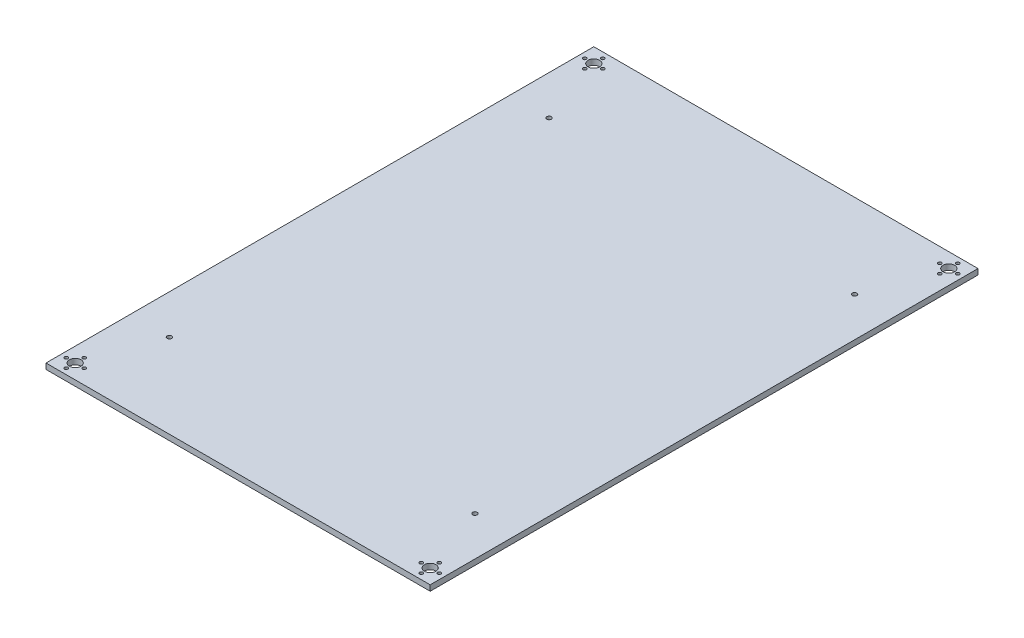
ISO-10303-21;
HEADER;
FILE_DESCRIPTION(('STEP AP214'),'2;1');
FILE_NAME('part.step','',(''),(''),'','','');
FILE_SCHEMA(('AUTOMOTIVE_DESIGN { 1 0 10303 214 1 1 1 1 }'));
ENDSEC;
DATA;
#1=APPLICATION_CONTEXT('core data for automotive mechanical design processes');
#2=APPLICATION_PROTOCOL_DEFINITION('international standard','automotive_design',2000,#1);
#3=PRODUCT_CONTEXT('',#1,'mechanical');
#4=PRODUCT('Part','Part','',(#3));
#5=PRODUCT_RELATED_PRODUCT_CATEGORY('part','',(#4));
#6=PRODUCT_DEFINITION_FORMATION('','',#4);
#7=PRODUCT_DEFINITION_CONTEXT('part definition',#1,'design');
#8=PRODUCT_DEFINITION('design','',#6,#7);
#9=PRODUCT_DEFINITION_SHAPE('','',#8);
#10=(LENGTH_UNIT() NAMED_UNIT(*) SI_UNIT(.MILLI.,.METRE.));
#11=(NAMED_UNIT(*) PLANE_ANGLE_UNIT() SI_UNIT($,.RADIAN.));
#12=(NAMED_UNIT(*) SI_UNIT($,.STERADIAN.) SOLID_ANGLE_UNIT());
#13=UNCERTAINTY_MEASURE_WITH_UNIT(LENGTH_MEASURE(1.E-05),#10,'distance_accuracy_value','');
#14=(GEOMETRIC_REPRESENTATION_CONTEXT(3) GLOBAL_UNCERTAINTY_ASSIGNED_CONTEXT((#13)) GLOBAL_UNIT_ASSIGNED_CONTEXT((#10,
#11,#12)) REPRESENTATION_CONTEXT('',''));
#15=CARTESIAN_POINT('',(0.,0.,0.));
#16=DIRECTION('',(0.,0.,1.));
#17=DIRECTION('',(1.,0.,0.));
#18=AXIS2_PLACEMENT_3D('',#15,#16,#17);
#19=CARTESIAN_POINT('',(342.,5.,0.));
#20=DIRECTION('',(0.,0.,1.));
#21=DIRECTION('',(1.,0.,0.));
#22=AXIS2_PLACEMENT_3D('',#19,#20,#21);
#23=PLANE('',#22);
#24=DIRECTION('',(0.,1.,0.));
#25=VECTOR('',#24,1.);
#26=CARTESIAN_POINT('',(0.,5.,0.));
#27=LINE('',#26,#25);
#28=CARTESIAN_POINT('',(0.,0.,0.));
#29=VERTEX_POINT('',#28);
#30=CARTESIAN_POINT('',(0.,5.,0.));
#31=VERTEX_POINT('',#30);
#32=EDGE_CURVE('E114',#29,#31,#27,.T.);
#33=ORIENTED_EDGE('',*,*,#32,.T.);
#34=DIRECTION('',(-1.,0.,0.));
#35=VECTOR('',#34,1.);
#36=CARTESIAN_POINT('',(342.,5.,0.));
#37=LINE('',#36,#35);
#38=CARTESIAN_POINT('',(342.,5.,0.));
#39=VERTEX_POINT('',#38);
#40=EDGE_CURVE('E11',#39,#31,#37,.T.);
#41=ORIENTED_EDGE('',*,*,#40,.F.);
#42=DIRECTION('',(0.,1.,0.));
#43=VECTOR('',#42,1.);
#44=CARTESIAN_POINT('',(342.,5.,0.));
#45=LINE('',#44,#43);
#46=CARTESIAN_POINT('',(342.,0.,0.));
#47=VERTEX_POINT('',#46);
#48=EDGE_CURVE('E102',#47,#39,#45,.T.);
#49=ORIENTED_EDGE('',*,*,#48,.F.);
#50=DIRECTION('',(-1.,0.,0.));
#51=VECTOR('',#50,1.);
#52=CARTESIAN_POINT('',(342.,0.,0.));
#53=LINE('',#52,#51);
#54=EDGE_CURVE('E110',#47,#29,#53,.T.);
#55=ORIENTED_EDGE('',*,*,#54,.T.);
#56=EDGE_LOOP('',(#33,#41,#49,#55));
#57=FACE_BOUND('',#56,.T.);
#58=ADVANCED_FACE('F51',(#57),#23,.F.);
#59=CARTESIAN_POINT('',(342.,4.99999999999985,487.65));
#60=DIRECTION('',(0.,-1.,0.));
#61=DIRECTION('',(0.,0.,-1.));
#62=AXIS2_PLACEMENT_3D('',#59,#60,#61);
#63=PLANE('',#62);
#64=CARTESIAN_POINT('',(35.,4.99999999999987,412.825));
#65=DIRECTION('',(0.,1.,0.));
#66=DIRECTION('',(0.,0.,1.));
#67=AXIS2_PLACEMENT_3D('',#64,#65,#66);
#68=CIRCLE('',#67,2.);
#69=CARTESIAN_POINT('',(35.,4.99999999999987,414.825));
#70=VERTEX_POINT('',#69);
#71=EDGE_CURVE('E257',#70,#70,#68,.T.);
#72=ORIENTED_EDGE('',*,*,#71,.F.);
#73=EDGE_LOOP('',(#72));
#74=FACE_BOUND('',#73,.T.);
#75=CARTESIAN_POINT('',(307.,4.99999999999987,412.825));
#76=DIRECTION('',(0.,1.,0.));
#77=DIRECTION('',(0.,0.,1.));
#78=AXIS2_PLACEMENT_3D('',#75,#76,#77);
#79=CIRCLE('',#78,2.);
#80=CARTESIAN_POINT('',(307.,4.99999999999987,414.825));
#81=VERTEX_POINT('',#80);
#82=EDGE_CURVE('E263',#81,#81,#79,.T.);
#83=ORIENTED_EDGE('',*,*,#82,.F.);
#84=EDGE_LOOP('',(#83));
#85=FACE_BOUND('',#84,.T.);
#86=CARTESIAN_POINT('',(307.,4.99999999999998,74.825));
#87=DIRECTION('',(0.,1.,0.));
#88=DIRECTION('',(0.,0.,1.));
#89=AXIS2_PLACEMENT_3D('',#86,#87,#88);
#90=CIRCLE('',#89,2.);
#91=CARTESIAN_POINT('',(307.,4.99999999999998,76.825));
#92=VERTEX_POINT('',#91);
#93=EDGE_CURVE('E251',#92,#92,#90,.T.);
#94=ORIENTED_EDGE('',*,*,#93,.F.);
#95=EDGE_LOOP('',(#94));
#96=FACE_BOUND('',#95,.T.);
#97=CARTESIAN_POINT('',(35.,4.99999999999998,74.825));
#98=DIRECTION('',(0.,1.,0.));
#99=DIRECTION('',(0.,0.,1.));
#100=AXIS2_PLACEMENT_3D('',#97,#98,#99);
#101=CIRCLE('',#100,2.);
#102=CARTESIAN_POINT('',(35.,4.99999999999998,76.825));
#103=VERTEX_POINT('',#102);
#104=EDGE_CURVE('E248',#103,#103,#101,.T.);
#105=ORIENTED_EDGE('',*,*,#104,.F.);
#106=EDGE_LOOP('',(#105));
#107=FACE_BOUND('',#106,.T.);
#108=CARTESIAN_POINT('',(5.00000000000001,5.00000000000003,474.65));
#109=DIRECTION('',(0.,1.,0.));
#110=DIRECTION('',(0.,0.,1.));
#111=AXIS2_PLACEMENT_3D('',#108,#109,#110);
#112=CIRCLE('',#111,1.5);
#113=CARTESIAN_POINT('',(5.00000000000001,5.00000000000003,476.15));
#114=VERTEX_POINT('',#113);
#115=EDGE_CURVE('E197',#114,#114,#112,.T.);
#116=ORIENTED_EDGE('',*,*,#115,.F.);
#117=EDGE_LOOP('',(#116));
#118=FACE_BOUND('',#117,.T.);
#119=CARTESIAN_POINT('',(21.,5.00000000000003,474.65));
#120=DIRECTION('',(0.,1.,0.));
#121=DIRECTION('',(0.,0.,1.));
#122=AXIS2_PLACEMENT_3D('',#119,#120,#121);
#123=CIRCLE('',#122,1.5);
#124=CARTESIAN_POINT('',(21.,5.00000000000003,476.15));
#125=VERTEX_POINT('',#124);
#126=EDGE_CURVE('E186',#125,#125,#123,.T.);
#127=ORIENTED_EDGE('',*,*,#126,.F.);
#128=EDGE_LOOP('',(#127));
#129=FACE_BOUND('',#128,.T.);
#130=CARTESIAN_POINT('',(13.,5.00000000000003,482.65));
#131=DIRECTION('',(0.,1.,0.));
#132=DIRECTION('',(0.,0.,1.));
#133=AXIS2_PLACEMENT_3D('',#130,#131,#132);
#134=CIRCLE('',#133,1.5);
#135=CARTESIAN_POINT('',(13.,5.00000000000003,484.15));
#136=VERTEX_POINT('',#135);
#137=EDGE_CURVE('E185',#136,#136,#134,.T.);
#138=ORIENTED_EDGE('',*,*,#137,.F.);
#139=EDGE_LOOP('',(#138));
#140=FACE_BOUND('',#139,.T.);
#141=CARTESIAN_POINT('',(13.,5.,13.));
#142=DIRECTION('',(0.,1.,0.));
#143=DIRECTION('',(0.,0.,1.));
#144=AXIS2_PLACEMENT_3D('',#141,#142,#143);
#145=CIRCLE('',#144,5.09999999999999);
#146=CARTESIAN_POINT('',(13.,5.,18.1));
#147=VERTEX_POINT('',#146);
#148=EDGE_CURVE('E152',#147,#147,#145,.T.);
#149=ORIENTED_EDGE('',*,*,#148,.F.);
#150=EDGE_LOOP('',(#149));
#151=FACE_BOUND('',#150,.T.);
#152=CARTESIAN_POINT('',(13.,5.00000000000003,466.65));
#153=DIRECTION('',(0.,1.,0.));
#154=DIRECTION('',(0.,0.,1.));
#155=AXIS2_PLACEMENT_3D('',#152,#153,#154);
#156=CIRCLE('',#155,1.5);
#157=CARTESIAN_POINT('',(13.,5.00000000000003,468.15));
#158=VERTEX_POINT('',#157);
#159=EDGE_CURVE('E198',#158,#158,#156,.T.);
#160=ORIENTED_EDGE('',*,*,#159,.F.);
#161=EDGE_LOOP('',(#160));
#162=FACE_BOUND('',#161,.T.);
#163=CARTESIAN_POINT('',(321.,5.00000000000003,474.65));
#164=DIRECTION('',(0.,1.,0.));
#165=DIRECTION('',(0.,0.,1.));
#166=AXIS2_PLACEMENT_3D('',#163,#164,#165);
#167=CIRCLE('',#166,1.50000000000002);
#168=CARTESIAN_POINT('',(321.,5.00000000000003,476.15));
#169=VERTEX_POINT('',#168);
#170=EDGE_CURVE('E222',#169,#169,#167,.T.);
#171=ORIENTED_EDGE('',*,*,#170,.F.);
#172=EDGE_LOOP('',(#171));
#173=FACE_BOUND('',#172,.T.);
#174=CARTESIAN_POINT('',(329.,5.00000000000003,482.65));
#175=DIRECTION('',(0.,1.,0.));
#176=DIRECTION('',(0.,0.,1.));
#177=AXIS2_PLACEMENT_3D('',#174,#175,#176);
#178=CIRCLE('',#177,1.50000000000002);
#179=CARTESIAN_POINT('',(329.,5.00000000000003,484.15));
#180=VERTEX_POINT('',#179);
#181=EDGE_CURVE('E216',#180,#180,#178,.T.);
#182=ORIENTED_EDGE('',*,*,#181,.F.);
#183=EDGE_LOOP('',(#182));
#184=FACE_BOUND('',#183,.T.);
#185=CARTESIAN_POINT('',(329.,5.00000000000003,466.65));
#186=DIRECTION('',(0.,1.,0.));
#187=DIRECTION('',(0.,0.,1.));
#188=AXIS2_PLACEMENT_3D('',#185,#186,#187);
#189=CIRCLE('',#188,1.50000000000002);
#190=CARTESIAN_POINT('',(329.,5.00000000000003,468.15));
#191=VERTEX_POINT('',#190);
#192=EDGE_CURVE('E209',#191,#191,#189,.T.);
#193=ORIENTED_EDGE('',*,*,#192,.F.);
#194=EDGE_LOOP('',(#193));
#195=FACE_BOUND('',#194,.T.);
#196=CARTESIAN_POINT('',(21.,5.,13.));
#197=DIRECTION('',(0.,1.,0.));
#198=DIRECTION('',(0.,0.,1.));
#199=AXIS2_PLACEMENT_3D('',#196,#197,#198);
#200=CIRCLE('',#199,1.5);
#201=CARTESIAN_POINT('',(21.,5.,14.5));
#202=VERTEX_POINT('',#201);
#203=EDGE_CURVE('E144',#202,#202,#200,.T.);
#204=ORIENTED_EDGE('',*,*,#203,.F.);
#205=EDGE_LOOP('',(#204));
#206=FACE_BOUND('',#205,.T.);
#207=CARTESIAN_POINT('',(13.,5.,21.));
#208=DIRECTION('',(0.,1.,0.));
#209=DIRECTION('',(0.,0.,1.));
#210=AXIS2_PLACEMENT_3D('',#207,#208,#209);
#211=CIRCLE('',#210,1.5);
#212=CARTESIAN_POINT('',(13.,5.,22.5));
#213=VERTEX_POINT('',#212);
#214=EDGE_CURVE('E137',#213,#213,#211,.T.);
#215=ORIENTED_EDGE('',*,*,#214,.F.);
#216=EDGE_LOOP('',(#215));
#217=FACE_BOUND('',#216,.T.);
#218=CARTESIAN_POINT('',(13.,5.,5.));
#219=DIRECTION('',(0.,1.,0.));
#220=DIRECTION('',(0.,0.,1.));
#221=AXIS2_PLACEMENT_3D('',#218,#219,#220);
#222=CIRCLE('',#221,1.5);
#223=CARTESIAN_POINT('',(13.,5.,6.5));
#224=VERTEX_POINT('',#223);
#225=EDGE_CURVE('E138',#224,#224,#222,.T.);
#226=ORIENTED_EDGE('',*,*,#225,.F.);
#227=EDGE_LOOP('',(#226));
#228=FACE_BOUND('',#227,.T.);
#229=CARTESIAN_POINT('',(5.00000000000001,5.,13.));
#230=DIRECTION('',(0.,1.,0.));
#231=DIRECTION('',(0.,0.,1.));
#232=AXIS2_PLACEMENT_3D('',#229,#230,#231);
#233=CIRCLE('',#232,1.5);
#234=CARTESIAN_POINT('',(5.00000000000001,5.,14.5));
#235=VERTEX_POINT('',#234);
#236=EDGE_CURVE('E151',#235,#235,#233,.T.);
#237=ORIENTED_EDGE('',*,*,#236,.F.);
#238=EDGE_LOOP('',(#237));
#239=FACE_BOUND('',#238,.T.);
#240=CARTESIAN_POINT('',(321.,5.,13.));
#241=DIRECTION('',(0.,1.,0.));
#242=DIRECTION('',(0.,0.,1.));
#243=AXIS2_PLACEMENT_3D('',#240,#241,#242);
#244=CIRCLE('',#243,1.50000000000002);
#245=CARTESIAN_POINT('',(321.,5.,14.5));
#246=VERTEX_POINT('',#245);
#247=EDGE_CURVE('E131',#246,#246,#244,.T.);
#248=ORIENTED_EDGE('',*,*,#247,.F.);
#249=EDGE_LOOP('',(#248));
#250=FACE_BOUND('',#249,.T.);
#251=CARTESIAN_POINT('',(329.,5.,5.));
#252=DIRECTION('',(0.,1.,0.));
#253=DIRECTION('',(0.,0.,1.));
#254=AXIS2_PLACEMENT_3D('',#251,#252,#253);
#255=CIRCLE('',#254,1.50000000000002);
#256=CARTESIAN_POINT('',(329.,5.,6.50000000000002));
#257=VERTEX_POINT('',#256);
#258=EDGE_CURVE('E163',#257,#257,#255,.T.);
#259=ORIENTED_EDGE('',*,*,#258,.F.);
#260=EDGE_LOOP('',(#259));
#261=FACE_BOUND('',#260,.T.);
#262=CARTESIAN_POINT('',(329.,5.,21.));
#263=DIRECTION('',(0.,1.,0.));
#264=DIRECTION('',(0.,0.,1.));
#265=AXIS2_PLACEMENT_3D('',#262,#263,#264);
#266=CIRCLE('',#265,1.50000000000002);
#267=CARTESIAN_POINT('',(329.,5.,22.5));
#268=VERTEX_POINT('',#267);
#269=EDGE_CURVE('E164',#268,#268,#266,.T.);
#270=ORIENTED_EDGE('',*,*,#269,.F.);
#271=EDGE_LOOP('',(#270));
#272=FACE_BOUND('',#271,.T.);
#273=CARTESIAN_POINT('',(337.,5.,13.));
#274=DIRECTION('',(0.,1.,0.));
#275=DIRECTION('',(0.,0.,1.));
#276=AXIS2_PLACEMENT_3D('',#273,#274,#275);
#277=CIRCLE('',#276,1.50000000000002);
#278=CARTESIAN_POINT('',(337.,5.,14.5));
#279=VERTEX_POINT('',#278);
#280=EDGE_CURVE('E174',#279,#279,#277,.T.);
#281=ORIENTED_EDGE('',*,*,#280,.F.);
#282=EDGE_LOOP('',(#281));
#283=FACE_BOUND('',#282,.T.);
#284=CARTESIAN_POINT('',(329.,5.00000000000003,474.65));
#285=DIRECTION('',(0.,1.,0.));
#286=DIRECTION('',(0.,0.,1.));
#287=AXIS2_PLACEMENT_3D('',#284,#285,#286);
#288=CIRCLE('',#287,5.09999999999998);
#289=CARTESIAN_POINT('',(329.,5.00000000000003,479.75));
#290=VERTEX_POINT('',#289);
#291=EDGE_CURVE('E234',#290,#290,#288,.T.);
#292=ORIENTED_EDGE('',*,*,#291,.F.);
#293=EDGE_LOOP('',(#292));
#294=FACE_BOUND('',#293,.T.);
#295=CARTESIAN_POINT('',(13.,5.00000000000003,474.65));
#296=DIRECTION('',(0.,1.,0.));
#297=DIRECTION('',(0.,0.,1.));
#298=AXIS2_PLACEMENT_3D('',#295,#296,#297);
#299=CIRCLE('',#298,5.09999999999998);
#300=CARTESIAN_POINT('',(13.,5.00000000000003,479.75));
#301=VERTEX_POINT('',#300);
#302=EDGE_CURVE('E233',#301,#301,#299,.T.);
#303=ORIENTED_EDGE('',*,*,#302,.F.);
#304=EDGE_LOOP('',(#303));
#305=FACE_BOUND('',#304,.T.);
#306=CARTESIAN_POINT('',(337.,5.00000000000003,474.65));
#307=DIRECTION('',(0.,1.,0.));
#308=DIRECTION('',(0.,0.,1.));
#309=AXIS2_PLACEMENT_3D('',#306,#307,#308);
#310=CIRCLE('',#309,1.50000000000002);
#311=CARTESIAN_POINT('',(337.,5.00000000000003,476.15));
#312=VERTEX_POINT('',#311);
#313=EDGE_CURVE('E210',#312,#312,#310,.T.);
#314=ORIENTED_EDGE('',*,*,#313,.F.);
#315=EDGE_LOOP('',(#314));
#316=FACE_BOUND('',#315,.T.);
#317=CARTESIAN_POINT('',(329.,5.,13.));
#318=DIRECTION('',(0.,1.,0.));
#319=DIRECTION('',(0.,0.,1.));
#320=AXIS2_PLACEMENT_3D('',#317,#318,#319);
#321=CIRCLE('',#320,5.09999999999998);
#322=CARTESIAN_POINT('',(329.,5.,18.1));
#323=VERTEX_POINT('',#322);
#324=EDGE_CURVE('E128',#323,#323,#321,.T.);
#325=ORIENTED_EDGE('',*,*,#324,.F.);
#326=EDGE_LOOP('',(#325));
#327=FACE_BOUND('',#326,.T.);
#328=DIRECTION('',(0.,0.,1.));
#329=VECTOR('',#328,1.);
#330=CARTESIAN_POINT('',(0.,4.99999999999985,487.65));
#331=LINE('',#330,#329);
#332=CARTESIAN_POINT('',(0.,4.99999999999985,487.65));
#333=VERTEX_POINT('',#332);
#334=EDGE_CURVE('E106',#31,#333,#331,.T.);
#335=ORIENTED_EDGE('',*,*,#334,.T.);
#336=DIRECTION('',(-1.,0.,0.));
#337=VECTOR('',#336,1.);
#338=CARTESIAN_POINT('',(342.,4.99999999999985,487.65));
#339=LINE('',#338,#337);
#340=CARTESIAN_POINT('',(342.,4.99999999999985,487.65));
#341=VERTEX_POINT('',#340);
#342=EDGE_CURVE('E59',#341,#333,#339,.T.);
#343=ORIENTED_EDGE('',*,*,#342,.F.);
#344=DIRECTION('',(0.,0.,1.));
#345=VECTOR('',#344,1.);
#346=CARTESIAN_POINT('',(342.,4.99999999999985,487.65));
#347=LINE('',#346,#345);
#348=EDGE_CURVE('E97',#39,#341,#347,.T.);
#349=ORIENTED_EDGE('',*,*,#348,.F.);
#350=ORIENTED_EDGE('',*,*,#40,.T.);
#351=EDGE_LOOP('',(#335,#343,#349,#350));
#352=FACE_BOUND('',#351,.T.);
#353=ADVANCED_FACE('F105',(#74,#85,#96,#107,#118,#129,#140,#151,#162,#173,#184,#195,#206,#217,
#228,#239,#250,#261,#272,#283,#294,#305,#316,#327,#352),#63,.F.);
#354=CARTESIAN_POINT('',(342.,-2.09019654061472E-13,487.65));
#355=DIRECTION('',(0.,0.,-1.));
#356=DIRECTION('',(-1.,0.,0.));
#357=AXIS2_PLACEMENT_3D('',#354,#355,#356);
#358=PLANE('',#357);
#359=DIRECTION('',(0.,-1.,0.));
#360=VECTOR('',#359,1.);
#361=CARTESIAN_POINT('',(0.,-2.09019654061472E-13,487.65));
#362=LINE('',#361,#360);
#363=CARTESIAN_POINT('',(0.,-2.09019654061472E-13,487.65));
#364=VERTEX_POINT('',#363);
#365=EDGE_CURVE('E84',#333,#364,#362,.T.);
#366=ORIENTED_EDGE('',*,*,#365,.T.);
#367=DIRECTION('',(-1.,0.,0.));
#368=VECTOR('',#367,1.);
#369=CARTESIAN_POINT('',(342.,-2.09019654061472E-13,487.65));
#370=LINE('',#369,#368);
#371=CARTESIAN_POINT('',(342.,-2.09019654061472E-13,487.65));
#372=VERTEX_POINT('',#371);
#373=EDGE_CURVE('E107',#372,#364,#370,.T.);
#374=ORIENTED_EDGE('',*,*,#373,.F.);
#375=DIRECTION('',(0.,-1.,0.));
#376=VECTOR('',#375,1.);
#377=CARTESIAN_POINT('',(342.,-2.09019654061472E-13,487.65));
#378=LINE('',#377,#376);
#379=EDGE_CURVE('E100',#341,#372,#378,.T.);
#380=ORIENTED_EDGE('',*,*,#379,.F.);
#381=ORIENTED_EDGE('',*,*,#342,.T.);
#382=EDGE_LOOP('',(#366,#374,#380,#381));
#383=FACE_BOUND('',#382,.T.);
#384=ADVANCED_FACE('F108',(#383),#358,.F.);
#385=CARTESIAN_POINT('',(342.,0.,0.));
#386=DIRECTION('',(0.,1.,0.));
#387=DIRECTION('',(0.,0.,1.));
#388=AXIS2_PLACEMENT_3D('',#385,#386,#387);
#389=PLANE('',#388);
#390=CARTESIAN_POINT('',(35.,-3.66026653431106E-13,412.825));
#391=DIRECTION('',(0.,1.,0.));
#392=DIRECTION('',(0.,0.,1.));
#393=AXIS2_PLACEMENT_3D('',#390,#391,#392);
#394=CIRCLE('',#393,2.);
#395=CARTESIAN_POINT('',(35.,-3.66638511193575E-13,414.825));
#396=VERTEX_POINT('',#395);
#397=EDGE_CURVE('E254',#396,#396,#394,.T.);
#398=ORIENTED_EDGE('',*,*,#397,.T.);
#399=EDGE_LOOP('',(#398));
#400=FACE_BOUND('',#399,.T.);
#401=CARTESIAN_POINT('',(307.,-3.66026653431106E-13,412.825));
#402=DIRECTION('',(0.,1.,0.));
#403=DIRECTION('',(0.,0.,1.));
#404=AXIS2_PLACEMENT_3D('',#401,#402,#403);
#405=CIRCLE('',#404,2.);
#406=CARTESIAN_POINT('',(307.,-3.66638511193575E-13,414.825));
#407=VERTEX_POINT('',#406);
#408=EDGE_CURVE('E260',#407,#407,#405,.T.);
#409=ORIENTED_EDGE('',*,*,#408,.T.);
#410=EDGE_LOOP('',(#409));
#411=FACE_BOUND('',#410,.T.);
#412=CARTESIAN_POINT('',(307.,-2.61943244872498E-13,74.825));
#413=DIRECTION('',(0.,1.,0.));
#414=DIRECTION('',(0.,0.,1.));
#415=AXIS2_PLACEMENT_3D('',#412,#413,#414);
#416=CIRCLE('',#415,2.);
#417=CARTESIAN_POINT('',(307.,-2.62555102634967E-13,76.825));
#418=VERTEX_POINT('',#417);
#419=EDGE_CURVE('E266',#418,#418,#416,.T.);
#420=ORIENTED_EDGE('',*,*,#419,.T.);
#421=EDGE_LOOP('',(#420));
#422=FACE_BOUND('',#421,.T.);
#423=CARTESIAN_POINT('',(35.,-2.61943244872498E-13,74.825));
#424=DIRECTION('',(0.,1.,0.));
#425=DIRECTION('',(0.,0.,1.));
#426=AXIS2_PLACEMENT_3D('',#423,#424,#425);
#427=CIRCLE('',#426,2.);
#428=CARTESIAN_POINT('',(35.,-2.62555102634967E-13,76.825));
#429=VERTEX_POINT('',#428);
#430=EDGE_CURVE('E245',#429,#429,#427,.T.);
#431=ORIENTED_EDGE('',*,*,#430,.T.);
#432=EDGE_LOOP('',(#431));
#433=FACE_BOUND('',#432,.T.);
#434=CARTESIAN_POINT('',(5.00000000000001,-2.09901540593194E-13,474.65));
#435=DIRECTION('',(0.,1.,0.));
#436=DIRECTION('',(0.,0.,1.));
#437=AXIS2_PLACEMENT_3D('',#434,#435,#436);
#438=CIRCLE('',#437,1.5);
#439=CARTESIAN_POINT('',(5.00000000000001,-2.09808409411591E-13,476.15));
#440=VERTEX_POINT('',#439);
#441=EDGE_CURVE('E194',#440,#440,#438,.T.);
#442=ORIENTED_EDGE('',*,*,#441,.T.);
#443=EDGE_LOOP('',(#442));
#444=FACE_BOUND('',#443,.T.);
#445=CARTESIAN_POINT('',(21.,-2.09901540593194E-13,474.65));
#446=DIRECTION('',(0.,1.,0.));
#447=DIRECTION('',(0.,0.,1.));
#448=AXIS2_PLACEMENT_3D('',#445,#446,#447);
#449=CIRCLE('',#448,1.5);
#450=CARTESIAN_POINT('',(21.,-2.09808409411591E-13,476.15));
#451=VERTEX_POINT('',#450);
#452=EDGE_CURVE('E201',#451,#451,#449,.T.);
#453=ORIENTED_EDGE('',*,*,#452,.T.);
#454=EDGE_LOOP('',(#453));
#455=FACE_BOUND('',#454,.T.);
#456=CARTESIAN_POINT('',(13.,-2.09034178855205E-13,482.65));
#457=DIRECTION('',(0.,1.,0.));
#458=DIRECTION('',(0.,0.,1.));
#459=AXIS2_PLACEMENT_3D('',#456,#457,#458);
#460=CIRCLE('',#459,1.5);
#461=CARTESIAN_POINT('',(13.,-2.08941047673603E-13,484.15));
#462=VERTEX_POINT('',#461);
#463=EDGE_CURVE('E182',#462,#462,#460,.T.);
#464=ORIENTED_EDGE('',*,*,#463,.T.);
#465=EDGE_LOOP('',(#464));
#466=FACE_BOUND('',#465,.T.);
#467=CARTESIAN_POINT('',(13.,-2.38524477946811E-13,13.));
#468=DIRECTION('',(0.,1.,0.));
#469=DIRECTION('',(0.,0.,1.));
#470=AXIS2_PLACEMENT_3D('',#467,#468,#469);
#471=CIRCLE('',#470,5.09999999999999);
#472=CARTESIAN_POINT('',(13.,-2.38207831929364E-13,18.1));
#473=VERTEX_POINT('',#472);
#474=EDGE_CURVE('E189',#473,#473,#471,.T.);
#475=ORIENTED_EDGE('',*,*,#474,.T.);
#476=EDGE_LOOP('',(#475));
#477=FACE_BOUND('',#476,.T.);
#478=CARTESIAN_POINT('',(13.,-2.10768902331182E-13,466.65));
#479=DIRECTION('',(0.,1.,0.));
#480=DIRECTION('',(0.,0.,1.));
#481=AXIS2_PLACEMENT_3D('',#478,#479,#480);
#482=CIRCLE('',#481,1.5);
#483=CARTESIAN_POINT('',(13.,-2.1067577114958E-13,468.15));
#484=VERTEX_POINT('',#483);
#485=EDGE_CURVE('E225',#484,#484,#482,.T.);
#486=ORIENTED_EDGE('',*,*,#485,.T.);
#487=EDGE_LOOP('',(#486));
#488=FACE_BOUND('',#487,.T.);
#489=CARTESIAN_POINT('',(321.,-2.09901540593194E-13,474.65));
#490=DIRECTION('',(0.,1.,0.));
#491=DIRECTION('',(0.,0.,1.));
#492=AXIS2_PLACEMENT_3D('',#489,#490,#491);
#493=CIRCLE('',#492,1.50000000000002);
#494=CARTESIAN_POINT('',(321.,-2.09808409411591E-13,476.15));
#495=VERTEX_POINT('',#494);
#496=EDGE_CURVE('E219',#495,#495,#493,.T.);
#497=ORIENTED_EDGE('',*,*,#496,.T.);
#498=EDGE_LOOP('',(#497));
#499=FACE_BOUND('',#498,.T.);
#500=CARTESIAN_POINT('',(329.,-2.09034178855205E-13,482.65));
#501=DIRECTION('',(0.,1.,0.));
#502=DIRECTION('',(0.,0.,1.));
#503=AXIS2_PLACEMENT_3D('',#500,#501,#502);
#504=CIRCLE('',#503,1.50000000000002);
#505=CARTESIAN_POINT('',(329.,-2.08941047673603E-13,484.15));
#506=VERTEX_POINT('',#505);
#507=EDGE_CURVE('E213',#506,#506,#504,.T.);
#508=ORIENTED_EDGE('',*,*,#507,.T.);
#509=EDGE_LOOP('',(#508));
#510=FACE_BOUND('',#509,.T.);
#511=CARTESIAN_POINT('',(329.,-2.10768902331182E-13,466.65));
#512=DIRECTION('',(0.,1.,0.));
#513=DIRECTION('',(0.,0.,1.));
#514=AXIS2_PLACEMENT_3D('',#511,#512,#513);
#515=CIRCLE('',#514,1.50000000000002);
#516=CARTESIAN_POINT('',(329.,-2.1067577114958E-13,468.15));
#517=VERTEX_POINT('',#516);
#518=EDGE_CURVE('E206',#517,#517,#515,.T.);
#519=ORIENTED_EDGE('',*,*,#518,.T.);
#520=EDGE_LOOP('',(#519));
#521=FACE_BOUND('',#520,.T.);
#522=CARTESIAN_POINT('',(21.,-2.38524477946811E-13,13.));
#523=DIRECTION('',(0.,1.,0.));
#524=DIRECTION('',(0.,0.,1.));
#525=AXIS2_PLACEMENT_3D('',#522,#523,#524);
#526=CIRCLE('',#525,1.5);
#527=CARTESIAN_POINT('',(21.,-2.38431346765209E-13,14.5));
#528=VERTEX_POINT('',#527);
#529=EDGE_CURVE('E141',#528,#528,#526,.T.);
#530=ORIENTED_EDGE('',*,*,#529,.T.);
#531=EDGE_LOOP('',(#530));
#532=FACE_BOUND('',#531,.T.);
#533=CARTESIAN_POINT('',(13.,-2.37657116208823E-13,21.));
#534=DIRECTION('',(0.,1.,0.));
#535=DIRECTION('',(0.,0.,1.));
#536=AXIS2_PLACEMENT_3D('',#533,#534,#535);
#537=CIRCLE('',#536,1.5);
#538=CARTESIAN_POINT('',(13.,-2.3756398502722E-13,22.5));
#539=VERTEX_POINT('',#538);
#540=EDGE_CURVE('E134',#539,#539,#537,.T.);
#541=ORIENTED_EDGE('',*,*,#540,.T.);
#542=EDGE_LOOP('',(#541));
#543=FACE_BOUND('',#542,.T.);
#544=CARTESIAN_POINT('',(13.,-2.39391839684799E-13,5.));
#545=DIRECTION('',(0.,1.,0.));
#546=DIRECTION('',(0.,0.,1.));
#547=AXIS2_PLACEMENT_3D('',#544,#545,#546);
#548=CIRCLE('',#547,1.5);
#549=CARTESIAN_POINT('',(13.,-2.39298708503197E-13,6.5));
#550=VERTEX_POINT('',#549);
#551=EDGE_CURVE('E155',#550,#550,#548,.T.);
#552=ORIENTED_EDGE('',*,*,#551,.T.);
#553=EDGE_LOOP('',(#552));
#554=FACE_BOUND('',#553,.T.);
#555=CARTESIAN_POINT('',(5.00000000000001,-2.38524477946811E-13,13.));
#556=DIRECTION('',(0.,1.,0.));
#557=DIRECTION('',(0.,0.,1.));
#558=AXIS2_PLACEMENT_3D('',#555,#556,#557);
#559=CIRCLE('',#558,1.5);
#560=CARTESIAN_POINT('',(5.00000000000001,-2.38431346765209E-13,14.5));
#561=VERTEX_POINT('',#560);
#562=EDGE_CURVE('E148',#561,#561,#559,.T.);
#563=ORIENTED_EDGE('',*,*,#562,.T.);
#564=EDGE_LOOP('',(#563));
#565=FACE_BOUND('',#564,.T.);
#566=CARTESIAN_POINT('',(321.,-2.38524477946811E-13,13.));
#567=DIRECTION('',(0.,1.,0.));
#568=DIRECTION('',(0.,0.,1.));
#569=AXIS2_PLACEMENT_3D('',#566,#567,#568);
#570=CIRCLE('',#569,1.50000000000002);
#571=CARTESIAN_POINT('',(321.,-2.38431346765209E-13,14.5));
#572=VERTEX_POINT('',#571);
#573=EDGE_CURVE('E167',#572,#572,#570,.T.);
#574=ORIENTED_EDGE('',*,*,#573,.T.);
#575=EDGE_LOOP('',(#574));
#576=FACE_BOUND('',#575,.T.);
#577=CARTESIAN_POINT('',(329.,-2.39391839684799E-13,5.));
#578=DIRECTION('',(0.,1.,0.));
#579=DIRECTION('',(0.,0.,1.));
#580=AXIS2_PLACEMENT_3D('',#577,#578,#579);
#581=CIRCLE('',#580,1.50000000000002);
#582=CARTESIAN_POINT('',(329.,-2.39298708503197E-13,6.50000000000002));
#583=VERTEX_POINT('',#582);
#584=EDGE_CURVE('E160',#583,#583,#581,.T.);
#585=ORIENTED_EDGE('',*,*,#584,.T.);
#586=EDGE_LOOP('',(#585));
#587=FACE_BOUND('',#586,.T.);
#588=CARTESIAN_POINT('',(329.,-2.37657116208823E-13,21.));
#589=DIRECTION('',(0.,1.,0.));
#590=DIRECTION('',(0.,0.,1.));
#591=AXIS2_PLACEMENT_3D('',#588,#589,#590);
#592=CIRCLE('',#591,1.50000000000002);
#593=CARTESIAN_POINT('',(329.,-2.3756398502722E-13,22.5));
#594=VERTEX_POINT('',#593);
#595=EDGE_CURVE('E177',#594,#594,#592,.T.);
#596=ORIENTED_EDGE('',*,*,#595,.T.);
#597=EDGE_LOOP('',(#596));
#598=FACE_BOUND('',#597,.T.);
#599=CARTESIAN_POINT('',(337.,-2.38524477946811E-13,13.));
#600=DIRECTION('',(0.,1.,0.));
#601=DIRECTION('',(0.,0.,1.));
#602=AXIS2_PLACEMENT_3D('',#599,#600,#601);
#603=CIRCLE('',#602,1.50000000000002);
#604=CARTESIAN_POINT('',(337.,-2.38431346765209E-13,14.5));
#605=VERTEX_POINT('',#604);
#606=EDGE_CURVE('E147',#605,#605,#603,.T.);
#607=ORIENTED_EDGE('',*,*,#606,.T.);
#608=EDGE_LOOP('',(#607));
#609=FACE_BOUND('',#608,.T.);
#610=CARTESIAN_POINT('',(329.,-2.09901540593194E-13,474.65));
#611=DIRECTION('',(0.,1.,0.));
#612=DIRECTION('',(0.,0.,1.));
#613=AXIS2_PLACEMENT_3D('',#610,#611,#612);
#614=CIRCLE('',#613,5.09999999999998);
#615=CARTESIAN_POINT('',(329.,-2.09584894575746E-13,479.75));
#616=VERTEX_POINT('',#615);
#617=EDGE_CURVE('E242',#616,#616,#614,.T.);
#618=ORIENTED_EDGE('',*,*,#617,.T.);
#619=EDGE_LOOP('',(#618));
#620=FACE_BOUND('',#619,.T.);
#621=CARTESIAN_POINT('',(13.,-2.09901540593194E-13,474.65));
#622=DIRECTION('',(0.,1.,0.));
#623=DIRECTION('',(0.,0.,1.));
#624=AXIS2_PLACEMENT_3D('',#621,#622,#623);
#625=CIRCLE('',#624,5.09999999999998);
#626=CARTESIAN_POINT('',(13.,-2.09584894575746E-13,479.75));
#627=VERTEX_POINT('',#626);
#628=EDGE_CURVE('E230',#627,#627,#625,.T.);
#629=ORIENTED_EDGE('',*,*,#628,.T.);
#630=EDGE_LOOP('',(#629));
#631=FACE_BOUND('',#630,.T.);
#632=CARTESIAN_POINT('',(337.,-2.09901540593194E-13,474.65));
#633=DIRECTION('',(0.,1.,0.));
#634=DIRECTION('',(0.,0.,1.));
#635=AXIS2_PLACEMENT_3D('',#632,#633,#634);
#636=CIRCLE('',#635,1.50000000000002);
#637=CARTESIAN_POINT('',(337.,-2.09808409411591E-13,476.15));
#638=VERTEX_POINT('',#637);
#639=EDGE_CURVE('E237',#638,#638,#636,.T.);
#640=ORIENTED_EDGE('',*,*,#639,.T.);
#641=EDGE_LOOP('',(#640));
#642=FACE_BOUND('',#641,.T.);
#643=CARTESIAN_POINT('',(329.,-2.38524477946811E-13,13.));
#644=DIRECTION('',(0.,1.,0.));
#645=DIRECTION('',(0.,0.,1.));
#646=AXIS2_PLACEMENT_3D('',#643,#644,#645);
#647=CIRCLE('',#646,5.09999999999998);
#648=CARTESIAN_POINT('',(329.,-2.38207831929364E-13,18.1));
#649=VERTEX_POINT('',#648);
#650=EDGE_CURVE('E117',#649,#649,#647,.T.);
#651=ORIENTED_EDGE('',*,*,#650,.T.);
#652=EDGE_LOOP('',(#651));
#653=FACE_BOUND('',#652,.T.);
#654=DIRECTION('',(0.,0.,-1.));
#655=VECTOR('',#654,1.);
#656=CARTESIAN_POINT('',(0.,0.,0.));
#657=LINE('',#656,#655);
#658=EDGE_CURVE('E90',#364,#29,#657,.T.);
#659=ORIENTED_EDGE('',*,*,#658,.T.);
#660=ORIENTED_EDGE('',*,*,#54,.F.);
#661=DIRECTION('',(0.,0.,-1.));
#662=VECTOR('',#661,1.);
#663=CARTESIAN_POINT('',(342.,0.,0.));
#664=LINE('',#663,#662);
#665=EDGE_CURVE('E67',#372,#47,#664,.T.);
#666=ORIENTED_EDGE('',*,*,#665,.F.);
#667=ORIENTED_EDGE('',*,*,#373,.T.);
#668=EDGE_LOOP('',(#659,#660,#666,#667));
#669=FACE_BOUND('',#668,.T.);
#670=ADVANCED_FACE('F122',(#400,#411,#422,#433,#444,#455,#466,#477,#488,#499,#510,#521,#532,
#543,#554,#565,#576,#587,#598,#609,#620,#631,#642,#653,#669),#389,.F.);
#671=CARTESIAN_POINT('',(342.,0.,0.));
#672=DIRECTION('',(-1.,0.,0.));
#673=DIRECTION('',(0.,0.,1.));
#674=AXIS2_PLACEMENT_3D('',#671,#672,#673);
#675=PLANE('',#674);
#676=ORIENTED_EDGE('',*,*,#48,.T.);
#677=ORIENTED_EDGE('',*,*,#348,.T.);
#678=ORIENTED_EDGE('',*,*,#379,.T.);
#679=ORIENTED_EDGE('',*,*,#665,.T.);
#680=EDGE_LOOP('',(#676,#677,#678,#679));
#681=FACE_BOUND('',#680,.T.);
#682=ADVANCED_FACE('F98',(#681),#675,.F.);
#683=CARTESIAN_POINT('',(0.,0.,0.));
#684=DIRECTION('',(-1.,0.,0.));
#685=DIRECTION('',(0.,0.,1.));
#686=AXIS2_PLACEMENT_3D('',#683,#684,#685);
#687=PLANE('',#686);
#688=ORIENTED_EDGE('',*,*,#32,.F.);
#689=ORIENTED_EDGE('',*,*,#658,.F.);
#690=ORIENTED_EDGE('',*,*,#365,.F.);
#691=ORIENTED_EDGE('',*,*,#334,.F.);
#692=EDGE_LOOP('',(#688,#689,#690,#691));
#693=FACE_BOUND('',#692,.T.);
#694=ADVANCED_FACE('F125',(#693),#687,.T.);
#695=CARTESIAN_POINT('',(329.,-2.38524477946811E-13,13.));
#696=DIRECTION('',(0.,1.,0.));
#697=DIRECTION('',(0.,0.,1.));
#698=AXIS2_PLACEMENT_3D('',#695,#696,#697);
#699=CYLINDRICAL_SURFACE('',#698,5.09999999999998);
#700=ORIENTED_EDGE('',*,*,#650,.F.);
#701=EDGE_LOOP('',(#700));
#702=FACE_BOUND('',#701,.T.);
#703=ORIENTED_EDGE('',*,*,#324,.T.);
#704=EDGE_LOOP('',(#703));
#705=FACE_BOUND('',#704,.T.);
#706=ADVANCED_FACE('F319',(#702,#705),#699,.F.);
#707=CARTESIAN_POINT('',(337.,-2.09901540593194E-13,474.65));
#708=DIRECTION('',(0.,1.,0.));
#709=DIRECTION('',(0.,0.,1.));
#710=AXIS2_PLACEMENT_3D('',#707,#708,#709);
#711=CYLINDRICAL_SURFACE('',#710,1.50000000000002);
#712=ORIENTED_EDGE('',*,*,#639,.F.);
#713=EDGE_LOOP('',(#712));
#714=FACE_BOUND('',#713,.T.);
#715=ORIENTED_EDGE('',*,*,#313,.T.);
#716=EDGE_LOOP('',(#715));
#717=FACE_BOUND('',#716,.T.);
#718=ADVANCED_FACE('F321',(#714,#717),#711,.F.);
#719=CARTESIAN_POINT('',(13.,-2.09901540593194E-13,474.65));
#720=DIRECTION('',(0.,1.,0.));
#721=DIRECTION('',(0.,0.,1.));
#722=AXIS2_PLACEMENT_3D('',#719,#720,#721);
#723=CYLINDRICAL_SURFACE('',#722,5.09999999999998);
#724=ORIENTED_EDGE('',*,*,#628,.F.);
#725=EDGE_LOOP('',(#724));
#726=FACE_BOUND('',#725,.T.);
#727=ORIENTED_EDGE('',*,*,#302,.T.);
#728=EDGE_LOOP('',(#727));
#729=FACE_BOUND('',#728,.T.);
#730=ADVANCED_FACE('F328',(#726,#729),#723,.F.);
#731=CARTESIAN_POINT('',(329.,-2.09901540593194E-13,474.65));
#732=DIRECTION('',(0.,1.,0.));
#733=DIRECTION('',(0.,0.,1.));
#734=AXIS2_PLACEMENT_3D('',#731,#732,#733);
#735=CYLINDRICAL_SURFACE('',#734,5.09999999999998);
#736=ORIENTED_EDGE('',*,*,#617,.F.);
#737=EDGE_LOOP('',(#736));
#738=FACE_BOUND('',#737,.T.);
#739=ORIENTED_EDGE('',*,*,#291,.T.);
#740=EDGE_LOOP('',(#739));
#741=FACE_BOUND('',#740,.T.);
#742=ADVANCED_FACE('F578',(#738,#741),#735,.F.);
#743=CARTESIAN_POINT('',(337.,-2.38524477946811E-13,13.));
#744=DIRECTION('',(0.,1.,0.));
#745=DIRECTION('',(0.,0.,1.));
#746=AXIS2_PLACEMENT_3D('',#743,#744,#745);
#747=CYLINDRICAL_SURFACE('',#746,1.50000000000002);
#748=ORIENTED_EDGE('',*,*,#606,.F.);
#749=EDGE_LOOP('',(#748));
#750=FACE_BOUND('',#749,.T.);
#751=ORIENTED_EDGE('',*,*,#280,.T.);
#752=EDGE_LOOP('',(#751));
#753=FACE_BOUND('',#752,.T.);
#754=ADVANCED_FACE('F569',(#750,#753),#747,.F.);
#755=CARTESIAN_POINT('',(329.,-2.37657116208823E-13,21.));
#756=DIRECTION('',(0.,1.,0.));
#757=DIRECTION('',(0.,0.,1.));
#758=AXIS2_PLACEMENT_3D('',#755,#756,#757);
#759=CYLINDRICAL_SURFACE('',#758,1.50000000000002);
#760=ORIENTED_EDGE('',*,*,#595,.F.);
#761=EDGE_LOOP('',(#760));
#762=FACE_BOUND('',#761,.T.);
#763=ORIENTED_EDGE('',*,*,#269,.T.);
#764=EDGE_LOOP('',(#763));
#765=FACE_BOUND('',#764,.T.);
#766=ADVANCED_FACE('F560',(#762,#765),#759,.F.);
#767=CARTESIAN_POINT('',(329.,-2.39391839684799E-13,5.));
#768=DIRECTION('',(0.,1.,0.));
#769=DIRECTION('',(0.,0.,1.));
#770=AXIS2_PLACEMENT_3D('',#767,#768,#769);
#771=CYLINDRICAL_SURFACE('',#770,1.50000000000002);
#772=ORIENTED_EDGE('',*,*,#584,.F.);
#773=EDGE_LOOP('',(#772));
#774=FACE_BOUND('',#773,.T.);
#775=ORIENTED_EDGE('',*,*,#258,.T.);
#776=EDGE_LOOP('',(#775));
#777=FACE_BOUND('',#776,.T.);
#778=ADVANCED_FACE('F551',(#774,#777),#771,.F.);
#779=CARTESIAN_POINT('',(321.,-2.38524477946811E-13,13.));
#780=DIRECTION('',(0.,1.,0.));
#781=DIRECTION('',(0.,0.,1.));
#782=AXIS2_PLACEMENT_3D('',#779,#780,#781);
#783=CYLINDRICAL_SURFACE('',#782,1.50000000000002);
#784=ORIENTED_EDGE('',*,*,#573,.F.);
#785=EDGE_LOOP('',(#784));
#786=FACE_BOUND('',#785,.T.);
#787=ORIENTED_EDGE('',*,*,#247,.T.);
#788=EDGE_LOOP('',(#787));
#789=FACE_BOUND('',#788,.T.);
#790=ADVANCED_FACE('F542',(#786,#789),#783,.F.);
#791=CARTESIAN_POINT('',(5.00000000000001,-2.38524477946811E-13,13.));
#792=DIRECTION('',(0.,1.,0.));
#793=DIRECTION('',(0.,0.,1.));
#794=AXIS2_PLACEMENT_3D('',#791,#792,#793);
#795=CYLINDRICAL_SURFACE('',#794,1.5);
#796=ORIENTED_EDGE('',*,*,#562,.F.);
#797=EDGE_LOOP('',(#796));
#798=FACE_BOUND('',#797,.T.);
#799=ORIENTED_EDGE('',*,*,#236,.T.);
#800=EDGE_LOOP('',(#799));
#801=FACE_BOUND('',#800,.T.);
#802=ADVANCED_FACE('F533',(#798,#801),#795,.F.);
#803=CARTESIAN_POINT('',(13.,-2.39391839684799E-13,5.));
#804=DIRECTION('',(0.,1.,0.));
#805=DIRECTION('',(0.,0.,1.));
#806=AXIS2_PLACEMENT_3D('',#803,#804,#805);
#807=CYLINDRICAL_SURFACE('',#806,1.5);
#808=ORIENTED_EDGE('',*,*,#551,.F.);
#809=EDGE_LOOP('',(#808));
#810=FACE_BOUND('',#809,.T.);
#811=ORIENTED_EDGE('',*,*,#225,.T.);
#812=EDGE_LOOP('',(#811));
#813=FACE_BOUND('',#812,.T.);
#814=ADVANCED_FACE('F525',(#810,#813),#807,.F.);
#815=CARTESIAN_POINT('',(13.,-2.37657116208823E-13,21.));
#816=DIRECTION('',(0.,1.,0.));
#817=DIRECTION('',(0.,0.,1.));
#818=AXIS2_PLACEMENT_3D('',#815,#816,#817);
#819=CYLINDRICAL_SURFACE('',#818,1.5);
#820=ORIENTED_EDGE('',*,*,#540,.F.);
#821=EDGE_LOOP('',(#820));
#822=FACE_BOUND('',#821,.T.);
#823=ORIENTED_EDGE('',*,*,#214,.T.);
#824=EDGE_LOOP('',(#823));
#825=FACE_BOUND('',#824,.T.);
#826=ADVANCED_FACE('F516',(#822,#825),#819,.F.);
#827=CARTESIAN_POINT('',(21.,-2.38524477946811E-13,13.));
#828=DIRECTION('',(0.,1.,0.));
#829=DIRECTION('',(0.,0.,1.));
#830=AXIS2_PLACEMENT_3D('',#827,#828,#829);
#831=CYLINDRICAL_SURFACE('',#830,1.5);
#832=ORIENTED_EDGE('',*,*,#529,.F.);
#833=EDGE_LOOP('',(#832));
#834=FACE_BOUND('',#833,.T.);
#835=ORIENTED_EDGE('',*,*,#203,.T.);
#836=EDGE_LOOP('',(#835));
#837=FACE_BOUND('',#836,.T.);
#838=ADVANCED_FACE('F507',(#834,#837),#831,.F.);
#839=CARTESIAN_POINT('',(329.,-2.10768902331182E-13,466.65));
#840=DIRECTION('',(0.,1.,0.));
#841=DIRECTION('',(0.,0.,1.));
#842=AXIS2_PLACEMENT_3D('',#839,#840,#841);
#843=CYLINDRICAL_SURFACE('',#842,1.50000000000002);
#844=ORIENTED_EDGE('',*,*,#518,.F.);
#845=EDGE_LOOP('',(#844));
#846=FACE_BOUND('',#845,.T.);
#847=ORIENTED_EDGE('',*,*,#192,.T.);
#848=EDGE_LOOP('',(#847));
#849=FACE_BOUND('',#848,.T.);
#850=ADVANCED_FACE('F498',(#846,#849),#843,.F.);
#851=CARTESIAN_POINT('',(329.,-2.09034178855205E-13,482.65));
#852=DIRECTION('',(0.,1.,0.));
#853=DIRECTION('',(0.,0.,1.));
#854=AXIS2_PLACEMENT_3D('',#851,#852,#853);
#855=CYLINDRICAL_SURFACE('',#854,1.50000000000002);
#856=ORIENTED_EDGE('',*,*,#507,.F.);
#857=EDGE_LOOP('',(#856));
#858=FACE_BOUND('',#857,.T.);
#859=ORIENTED_EDGE('',*,*,#181,.T.);
#860=EDGE_LOOP('',(#859));
#861=FACE_BOUND('',#860,.T.);
#862=ADVANCED_FACE('F489',(#858,#861),#855,.F.);
#863=CARTESIAN_POINT('',(321.,-2.09901540593194E-13,474.65));
#864=DIRECTION('',(0.,1.,0.));
#865=DIRECTION('',(0.,0.,1.));
#866=AXIS2_PLACEMENT_3D('',#863,#864,#865);
#867=CYLINDRICAL_SURFACE('',#866,1.50000000000002);
#868=ORIENTED_EDGE('',*,*,#496,.F.);
#869=EDGE_LOOP('',(#868));
#870=FACE_BOUND('',#869,.T.);
#871=ORIENTED_EDGE('',*,*,#170,.T.);
#872=EDGE_LOOP('',(#871));
#873=FACE_BOUND('',#872,.T.);
#874=ADVANCED_FACE('F480',(#870,#873),#867,.F.);
#875=CARTESIAN_POINT('',(13.,-2.10768902331182E-13,466.65));
#876=DIRECTION('',(0.,1.,0.));
#877=DIRECTION('',(0.,0.,1.));
#878=AXIS2_PLACEMENT_3D('',#875,#876,#877);
#879=CYLINDRICAL_SURFACE('',#878,1.5);
#880=ORIENTED_EDGE('',*,*,#485,.F.);
#881=EDGE_LOOP('',(#880));
#882=FACE_BOUND('',#881,.T.);
#883=ORIENTED_EDGE('',*,*,#159,.T.);
#884=EDGE_LOOP('',(#883));
#885=FACE_BOUND('',#884,.T.);
#886=ADVANCED_FACE('F471',(#882,#885),#879,.F.);
#887=CARTESIAN_POINT('',(13.,-2.38524477946811E-13,13.));
#888=DIRECTION('',(0.,1.,0.));
#889=DIRECTION('',(0.,0.,1.));
#890=AXIS2_PLACEMENT_3D('',#887,#888,#889);
#891=CYLINDRICAL_SURFACE('',#890,5.09999999999999);
#892=ORIENTED_EDGE('',*,*,#474,.F.);
#893=EDGE_LOOP('',(#892));
#894=FACE_BOUND('',#893,.T.);
#895=ORIENTED_EDGE('',*,*,#148,.T.);
#896=EDGE_LOOP('',(#895));
#897=FACE_BOUND('',#896,.T.);
#898=ADVANCED_FACE('F462',(#894,#897),#891,.F.);
#899=CARTESIAN_POINT('',(13.,-2.09034178855205E-13,482.65));
#900=DIRECTION('',(0.,1.,0.));
#901=DIRECTION('',(0.,0.,1.));
#902=AXIS2_PLACEMENT_3D('',#899,#900,#901);
#903=CYLINDRICAL_SURFACE('',#902,1.5);
#904=ORIENTED_EDGE('',*,*,#463,.F.);
#905=EDGE_LOOP('',(#904));
#906=FACE_BOUND('',#905,.T.);
#907=ORIENTED_EDGE('',*,*,#137,.T.);
#908=EDGE_LOOP('',(#907));
#909=FACE_BOUND('',#908,.T.);
#910=ADVANCED_FACE('F453',(#906,#909),#903,.F.);
#911=CARTESIAN_POINT('',(21.,-2.09901540593194E-13,474.65));
#912=DIRECTION('',(0.,1.,0.));
#913=DIRECTION('',(0.,0.,1.));
#914=AXIS2_PLACEMENT_3D('',#911,#912,#913);
#915=CYLINDRICAL_SURFACE('',#914,1.5);
#916=ORIENTED_EDGE('',*,*,#452,.F.);
#917=EDGE_LOOP('',(#916));
#918=FACE_BOUND('',#917,.T.);
#919=ORIENTED_EDGE('',*,*,#126,.T.);
#920=EDGE_LOOP('',(#919));
#921=FACE_BOUND('',#920,.T.);
#922=ADVANCED_FACE('F445',(#918,#921),#915,.F.);
#923=CARTESIAN_POINT('',(5.00000000000001,-2.09901540593194E-13,474.65));
#924=DIRECTION('',(0.,1.,0.));
#925=DIRECTION('',(0.,0.,1.));
#926=AXIS2_PLACEMENT_3D('',#923,#924,#925);
#927=CYLINDRICAL_SURFACE('',#926,1.5);
#928=ORIENTED_EDGE('',*,*,#441,.F.);
#929=EDGE_LOOP('',(#928));
#930=FACE_BOUND('',#929,.T.);
#931=ORIENTED_EDGE('',*,*,#115,.T.);
#932=EDGE_LOOP('',(#931));
#933=FACE_BOUND('',#932,.T.);
#934=ADVANCED_FACE('F395',(#930,#933),#927,.F.);
#935=CARTESIAN_POINT('',(35.,-2.61943244872498E-13,74.825));
#936=DIRECTION('',(0.,1.,0.));
#937=DIRECTION('',(0.,0.,1.));
#938=AXIS2_PLACEMENT_3D('',#935,#936,#937);
#939=CYLINDRICAL_SURFACE('',#938,2.);
#940=ORIENTED_EDGE('',*,*,#430,.F.);
#941=EDGE_LOOP('',(#940));
#942=FACE_BOUND('',#941,.T.);
#943=ORIENTED_EDGE('',*,*,#104,.T.);
#944=EDGE_LOOP('',(#943));
#945=FACE_BOUND('',#944,.T.);
#946=ADVANCED_FACE('F404',(#942,#945),#939,.F.);
#947=CARTESIAN_POINT('',(307.,-2.61943244872498E-13,74.825));
#948=DIRECTION('',(0.,1.,0.));
#949=DIRECTION('',(0.,0.,1.));
#950=AXIS2_PLACEMENT_3D('',#947,#948,#949);
#951=CYLINDRICAL_SURFACE('',#950,2.);
#952=ORIENTED_EDGE('',*,*,#419,.F.);
#953=EDGE_LOOP('',(#952));
#954=FACE_BOUND('',#953,.T.);
#955=ORIENTED_EDGE('',*,*,#93,.T.);
#956=EDGE_LOOP('',(#955));
#957=FACE_BOUND('',#956,.T.);
#958=ADVANCED_FACE('F272',(#954,#957),#951,.F.);
#959=CARTESIAN_POINT('',(307.,-3.66026653431106E-13,412.825));
#960=DIRECTION('',(0.,1.,0.));
#961=DIRECTION('',(0.,0.,1.));
#962=AXIS2_PLACEMENT_3D('',#959,#960,#961);
#963=CYLINDRICAL_SURFACE('',#962,2.);
#964=ORIENTED_EDGE('',*,*,#408,.F.);
#965=EDGE_LOOP('',(#964));
#966=FACE_BOUND('',#965,.T.);
#967=ORIENTED_EDGE('',*,*,#82,.T.);
#968=EDGE_LOOP('',(#967));
#969=FACE_BOUND('',#968,.T.);
#970=ADVANCED_FACE('F416',(#966,#969),#963,.F.);
#971=CARTESIAN_POINT('',(35.,-3.66026653431106E-13,412.825));
#972=DIRECTION('',(0.,1.,0.));
#973=DIRECTION('',(0.,0.,1.));
#974=AXIS2_PLACEMENT_3D('',#971,#972,#973);
#975=CYLINDRICAL_SURFACE('',#974,2.);
#976=ORIENTED_EDGE('',*,*,#397,.F.);
#977=EDGE_LOOP('',(#976));
#978=FACE_BOUND('',#977,.T.);
#979=ORIENTED_EDGE('',*,*,#71,.T.);
#980=EDGE_LOOP('',(#979));
#981=FACE_BOUND('',#980,.T.);
#982=ADVANCED_FACE('F425',(#978,#981),#975,.F.);
#983=CLOSED_SHELL('',(#58,#353,#384,#670,#682,#694,#706,#718,#730,#742,#754,#766,#778,#790,#802,
#814,#826,#838,#850,#862,#874,#886,#898,#910,#922,#934,#946,#958,#970,#982));
#984=MANIFOLD_SOLID_BREP('B2',#983);
#985=ADVANCED_BREP_SHAPE_REPRESENTATION('',(#18,#984),#14);
#986=SHAPE_DEFINITION_REPRESENTATION(#9,#985);
ENDSEC;
END-ISO-10303-21;
